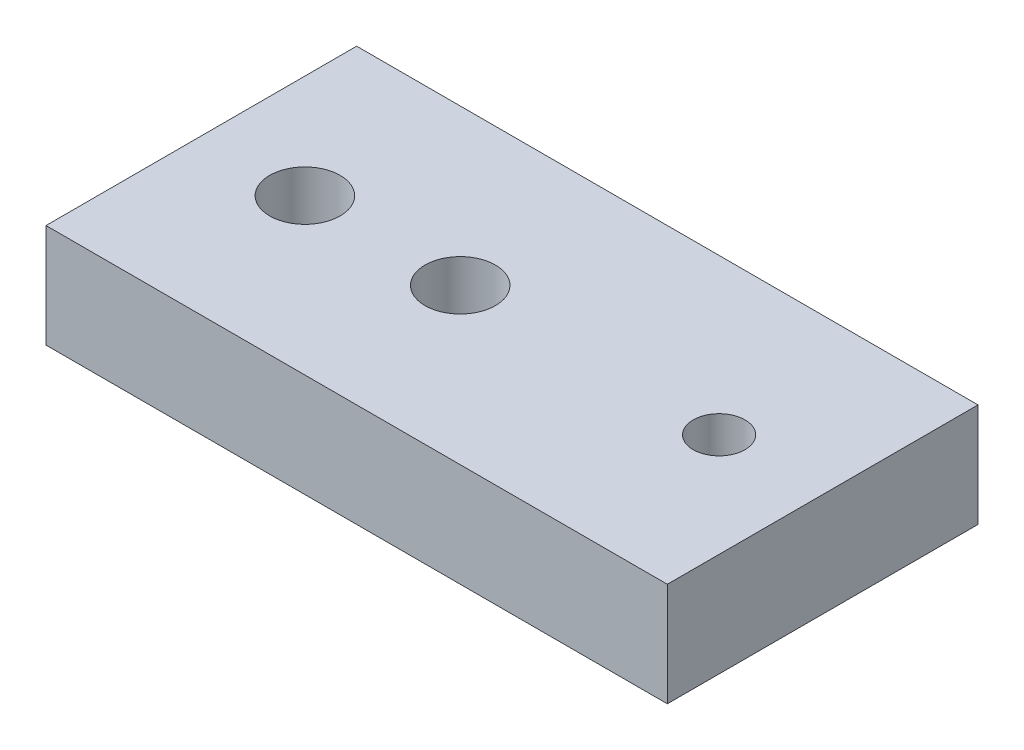
ISO-10303-21;
HEADER;
FILE_DESCRIPTION(('STEP AP214'),'2;1');
FILE_NAME('part.step','',(''),(''),'','','');
FILE_SCHEMA(('AUTOMOTIVE_DESIGN { 1 0 10303 214 1 1 1 1 }'));
ENDSEC;
DATA;
#1=APPLICATION_CONTEXT('core data for automotive mechanical design processes');
#2=APPLICATION_PROTOCOL_DEFINITION('international standard','automotive_design',2000,#1);
#3=PRODUCT_CONTEXT('',#1,'mechanical');
#4=PRODUCT('Part','Part','',(#3));
#5=PRODUCT_RELATED_PRODUCT_CATEGORY('part','',(#4));
#6=PRODUCT_DEFINITION_FORMATION('','',#4);
#7=PRODUCT_DEFINITION_CONTEXT('part definition',#1,'design');
#8=PRODUCT_DEFINITION('design','',#6,#7);
#9=PRODUCT_DEFINITION_SHAPE('','',#8);
#10=(LENGTH_UNIT() NAMED_UNIT(*) SI_UNIT(.MILLI.,.METRE.));
#11=(NAMED_UNIT(*) PLANE_ANGLE_UNIT() SI_UNIT($,.RADIAN.));
#12=(NAMED_UNIT(*) SI_UNIT($,.STERADIAN.) SOLID_ANGLE_UNIT());
#13=UNCERTAINTY_MEASURE_WITH_UNIT(LENGTH_MEASURE(1.E-05),#10,'distance_accuracy_value','');
#14=(GEOMETRIC_REPRESENTATION_CONTEXT(3) GLOBAL_UNCERTAINTY_ASSIGNED_CONTEXT((#13)) GLOBAL_UNIT_ASSIGNED_CONTEXT((#10,
#11,#12)) REPRESENTATION_CONTEXT('',''));
#15=CARTESIAN_POINT('',(0.,0.,0.));
#16=DIRECTION('',(0.,0.,1.));
#17=DIRECTION('',(1.,0.,0.));
#18=AXIS2_PLACEMENT_3D('',#15,#16,#17);
#19=CARTESIAN_POINT('',(30.,10.,-15.));
#20=DIRECTION('',(-1.,0.,0.));
#21=DIRECTION('',(0.,0.,1.));
#22=AXIS2_PLACEMENT_3D('',#19,#20,#21);
#23=PLANE('',#22);
#24=DIRECTION('',(0.,0.,-1.));
#25=VECTOR('',#24,1.);
#26=CARTESIAN_POINT('',(30.,0.,-15.));
#27=LINE('',#26,#25);
#28=CARTESIAN_POINT('',(30.,0.,15.));
#29=VERTEX_POINT('',#28);
#30=CARTESIAN_POINT('',(30.,0.,-15.));
#31=VERTEX_POINT('',#30);
#32=EDGE_CURVE('E101',#29,#31,#27,.T.);
#33=ORIENTED_EDGE('',*,*,#32,.T.);
#34=DIRECTION('',(0.,-1.,0.));
#35=VECTOR('',#34,1.);
#36=CARTESIAN_POINT('',(30.,10.,-15.));
#37=LINE('',#36,#35);
#38=CARTESIAN_POINT('',(30.,10.,-15.));
#39=VERTEX_POINT('',#38);
#40=EDGE_CURVE('E11',#39,#31,#37,.T.);
#41=ORIENTED_EDGE('',*,*,#40,.F.);
#42=DIRECTION('',(0.,0.,-1.));
#43=VECTOR('',#42,1.);
#44=CARTESIAN_POINT('',(30.,10.,-15.));
#45=LINE('',#44,#43);
#46=CARTESIAN_POINT('',(30.,10.,15.));
#47=VERTEX_POINT('',#46);
#48=EDGE_CURVE('E89',#47,#39,#45,.T.);
#49=ORIENTED_EDGE('',*,*,#48,.F.);
#50=DIRECTION('',(0.,-1.,0.));
#51=VECTOR('',#50,1.);
#52=CARTESIAN_POINT('',(30.,10.,15.));
#53=LINE('',#52,#51);
#54=EDGE_CURVE('E97',#47,#29,#53,.T.);
#55=ORIENTED_EDGE('',*,*,#54,.T.);
#56=EDGE_LOOP('',(#33,#41,#49,#55));
#57=FACE_BOUND('',#56,.T.);
#58=ADVANCED_FACE('F38',(#57),#23,.F.);
#59=CARTESIAN_POINT('',(-30.,10.,-15.));
#60=DIRECTION('',(0.,0.,1.));
#61=DIRECTION('',(1.,0.,0.));
#62=AXIS2_PLACEMENT_3D('',#59,#60,#61);
#63=PLANE('',#62);
#64=DIRECTION('',(-1.,0.,0.));
#65=VECTOR('',#64,1.);
#66=CARTESIAN_POINT('',(-30.,0.,-15.));
#67=LINE('',#66,#65);
#68=CARTESIAN_POINT('',(-30.,0.,-15.));
#69=VERTEX_POINT('',#68);
#70=EDGE_CURVE('E93',#31,#69,#67,.T.);
#71=ORIENTED_EDGE('',*,*,#70,.T.);
#72=DIRECTION('',(0.,-1.,0.));
#73=VECTOR('',#72,1.);
#74=CARTESIAN_POINT('',(-30.,10.,-15.));
#75=LINE('',#74,#73);
#76=CARTESIAN_POINT('',(-30.,10.,-15.));
#77=VERTEX_POINT('',#76);
#78=EDGE_CURVE('E46',#77,#69,#75,.T.);
#79=ORIENTED_EDGE('',*,*,#78,.F.);
#80=DIRECTION('',(-1.,0.,0.));
#81=VECTOR('',#80,1.);
#82=CARTESIAN_POINT('',(-30.,10.,-15.));
#83=LINE('',#82,#81);
#84=EDGE_CURVE('E84',#39,#77,#83,.T.);
#85=ORIENTED_EDGE('',*,*,#84,.F.);
#86=ORIENTED_EDGE('',*,*,#40,.T.);
#87=EDGE_LOOP('',(#71,#79,#85,#86));
#88=FACE_BOUND('',#87,.T.);
#89=ADVANCED_FACE('F92',(#88),#63,.F.);
#90=CARTESIAN_POINT('',(-30.,10.,-15.));
#91=DIRECTION('',(1.,0.,0.));
#92=DIRECTION('',(0.,0.,-1.));
#93=AXIS2_PLACEMENT_3D('',#90,#91,#92);
#94=PLANE('',#93);
#95=DIRECTION('',(0.,0.,1.));
#96=VECTOR('',#95,1.);
#97=CARTESIAN_POINT('',(-30.,0.,-15.));
#98=LINE('',#97,#96);
#99=CARTESIAN_POINT('',(-30.,0.,15.));
#100=VERTEX_POINT('',#99);
#101=EDGE_CURVE('E71',#69,#100,#98,.T.);
#102=ORIENTED_EDGE('',*,*,#101,.T.);
#103=DIRECTION('',(0.,-1.,0.));
#104=VECTOR('',#103,1.);
#105=CARTESIAN_POINT('',(-30.,10.,15.));
#106=LINE('',#105,#104);
#107=CARTESIAN_POINT('',(-30.,10.,15.));
#108=VERTEX_POINT('',#107);
#109=EDGE_CURVE('E94',#108,#100,#106,.T.);
#110=ORIENTED_EDGE('',*,*,#109,.F.);
#111=DIRECTION('',(0.,0.,1.));
#112=VECTOR('',#111,1.);
#113=CARTESIAN_POINT('',(-30.,10.,-15.));
#114=LINE('',#113,#112);
#115=EDGE_CURVE('E87',#77,#108,#114,.T.);
#116=ORIENTED_EDGE('',*,*,#115,.F.);
#117=ORIENTED_EDGE('',*,*,#78,.T.);
#118=EDGE_LOOP('',(#102,#110,#116,#117));
#119=FACE_BOUND('',#118,.T.);
#120=ADVANCED_FACE('F95',(#119),#94,.F.);
#121=CARTESIAN_POINT('',(-30.,10.,15.));
#122=DIRECTION('',(0.,0.,-1.));
#123=DIRECTION('',(-1.,0.,0.));
#124=AXIS2_PLACEMENT_3D('',#121,#122,#123);
#125=PLANE('',#124);
#126=DIRECTION('',(1.,0.,0.));
#127=VECTOR('',#126,1.);
#128=CARTESIAN_POINT('',(-30.,0.,15.));
#129=LINE('',#128,#127);
#130=EDGE_CURVE('E77',#100,#29,#129,.T.);
#131=ORIENTED_EDGE('',*,*,#130,.T.);
#132=ORIENTED_EDGE('',*,*,#54,.F.);
#133=DIRECTION('',(1.,0.,0.));
#134=VECTOR('',#133,1.);
#135=CARTESIAN_POINT('',(-30.,10.,15.));
#136=LINE('',#135,#134);
#137=EDGE_CURVE('E54',#108,#47,#136,.T.);
#138=ORIENTED_EDGE('',*,*,#137,.F.);
#139=ORIENTED_EDGE('',*,*,#109,.T.);
#140=EDGE_LOOP('',(#131,#132,#138,#139));
#141=FACE_BOUND('',#140,.T.);
#142=ADVANCED_FACE('F109',(#141),#125,.F.);
#143=CARTESIAN_POINT('',(0.,10.,0.));
#144=DIRECTION('',(0.,1.,0.));
#145=DIRECTION('',(0.,0.,1.));
#146=AXIS2_PLACEMENT_3D('',#143,#144,#145);
#147=PLANE('',#146);
#148=CARTESIAN_POINT('',(20.,10.,0.));
#149=DIRECTION('',(0.,1.,0.));
#150=DIRECTION('',(0.,0.,1.));
#151=AXIS2_PLACEMENT_3D('',#148,#149,#150);
#152=CIRCLE('',#151,2.5);
#153=CARTESIAN_POINT('',(20.,10.,2.5));
#154=VERTEX_POINT('',#153);
#155=EDGE_CURVE('E129',#154,#154,#152,.T.);
#156=ORIENTED_EDGE('',*,*,#155,.F.);
#157=EDGE_LOOP('',(#156));
#158=FACE_BOUND('',#157,.T.);
#159=CARTESIAN_POINT('',(-20.,10.,0.));
#160=DIRECTION('',(0.,1.,0.));
#161=DIRECTION('',(0.,0.,1.));
#162=AXIS2_PLACEMENT_3D('',#159,#160,#161);
#163=CIRCLE('',#162,3.39999999999999);
#164=CARTESIAN_POINT('',(-20.,10.,3.39999999999999));
#165=VERTEX_POINT('',#164);
#166=EDGE_CURVE('E123',#165,#165,#163,.T.);
#167=ORIENTED_EDGE('',*,*,#166,.F.);
#168=EDGE_LOOP('',(#167));
#169=FACE_BOUND('',#168,.T.);
#170=CARTESIAN_POINT('',(-5.,10.,0.));
#171=DIRECTION('',(0.,1.,0.));
#172=DIRECTION('',(0.,0.,1.));
#173=AXIS2_PLACEMENT_3D('',#170,#171,#172);
#174=CIRCLE('',#173,3.39999999999999);
#175=CARTESIAN_POINT('',(-5.,10.,3.39999999999999));
#176=VERTEX_POINT('',#175);
#177=EDGE_CURVE('E117',#176,#176,#174,.T.);
#178=ORIENTED_EDGE('',*,*,#177,.F.);
#179=EDGE_LOOP('',(#178));
#180=FACE_BOUND('',#179,.T.);
#181=ORIENTED_EDGE('',*,*,#48,.T.);
#182=ORIENTED_EDGE('',*,*,#84,.T.);
#183=ORIENTED_EDGE('',*,*,#115,.T.);
#184=ORIENTED_EDGE('',*,*,#137,.T.);
#185=EDGE_LOOP('',(#181,#182,#183,#184));
#186=FACE_BOUND('',#185,.T.);
#187=ADVANCED_FACE('F85',(#158,#169,#180,#186),#147,.T.);
#188=CARTESIAN_POINT('',(0.,0.,0.));
#189=DIRECTION('',(0.,1.,0.));
#190=DIRECTION('',(0.,0.,1.));
#191=AXIS2_PLACEMENT_3D('',#188,#189,#190);
#192=PLANE('',#191);
#193=CARTESIAN_POINT('',(20.,0.,0.));
#194=DIRECTION('',(0.,1.,0.));
#195=DIRECTION('',(0.,0.,1.));
#196=AXIS2_PLACEMENT_3D('',#193,#194,#195);
#197=CIRCLE('',#196,2.5);
#198=CARTESIAN_POINT('',(20.,0.,2.5));
#199=VERTEX_POINT('',#198);
#200=EDGE_CURVE('E126',#199,#199,#197,.T.);
#201=ORIENTED_EDGE('',*,*,#200,.T.);
#202=EDGE_LOOP('',(#201));
#203=FACE_BOUND('',#202,.T.);
#204=CARTESIAN_POINT('',(-20.,0.,0.));
#205=DIRECTION('',(0.,1.,0.));
#206=DIRECTION('',(0.,0.,1.));
#207=AXIS2_PLACEMENT_3D('',#204,#205,#206);
#208=CIRCLE('',#207,3.4);
#209=CARTESIAN_POINT('',(-20.,0.,3.4));
#210=VERTEX_POINT('',#209);
#211=EDGE_CURVE('E120',#210,#210,#208,.T.);
#212=ORIENTED_EDGE('',*,*,#211,.T.);
#213=EDGE_LOOP('',(#212));
#214=FACE_BOUND('',#213,.T.);
#215=CARTESIAN_POINT('',(-5.,0.,0.));
#216=DIRECTION('',(0.,1.,0.));
#217=DIRECTION('',(0.,0.,1.));
#218=AXIS2_PLACEMENT_3D('',#215,#216,#217);
#219=CIRCLE('',#218,3.4);
#220=CARTESIAN_POINT('',(-5.,0.,3.4));
#221=VERTEX_POINT('',#220);
#222=EDGE_CURVE('E104',#221,#221,#219,.T.);
#223=ORIENTED_EDGE('',*,*,#222,.T.);
#224=EDGE_LOOP('',(#223));
#225=FACE_BOUND('',#224,.T.);
#226=ORIENTED_EDGE('',*,*,#32,.F.);
#227=ORIENTED_EDGE('',*,*,#130,.F.);
#228=ORIENTED_EDGE('',*,*,#101,.F.);
#229=ORIENTED_EDGE('',*,*,#70,.F.);
#230=EDGE_LOOP('',(#226,#227,#228,#229));
#231=FACE_BOUND('',#230,.T.);
#232=ADVANCED_FACE('F112',(#203,#214,#225,#231),#192,.F.);
#233=CARTESIAN_POINT('',(-5.,10.,0.));
#234=DIRECTION('',(0.,1.,0.));
#235=DIRECTION('',(0.,0.,1.));
#236=AXIS2_PLACEMENT_3D('',#233,#234,#235);
#237=CYLINDRICAL_SURFACE('',#236,3.39999999999999);
#238=ORIENTED_EDGE('',*,*,#222,.F.);
#239=EDGE_LOOP('',(#238));
#240=FACE_BOUND('',#239,.T.);
#241=ORIENTED_EDGE('',*,*,#177,.T.);
#242=EDGE_LOOP('',(#241));
#243=FACE_BOUND('',#242,.T.);
#244=ADVANCED_FACE('F142',(#240,#243),#237,.F.);
#245=CARTESIAN_POINT('',(-20.,10.,0.));
#246=DIRECTION('',(0.,1.,0.));
#247=DIRECTION('',(0.,0.,1.));
#248=AXIS2_PLACEMENT_3D('',#245,#246,#247);
#249=CYLINDRICAL_SURFACE('',#248,3.39999999999999);
#250=ORIENTED_EDGE('',*,*,#211,.F.);
#251=EDGE_LOOP('',(#250));
#252=FACE_BOUND('',#251,.T.);
#253=ORIENTED_EDGE('',*,*,#166,.T.);
#254=EDGE_LOOP('',(#253));
#255=FACE_BOUND('',#254,.T.);
#256=ADVANCED_FACE('F144',(#252,#255),#249,.F.);
#257=CARTESIAN_POINT('',(20.,10.,0.));
#258=DIRECTION('',(0.,1.,0.));
#259=DIRECTION('',(0.,0.,1.));
#260=AXIS2_PLACEMENT_3D('',#257,#258,#259);
#261=CYLINDRICAL_SURFACE('',#260,2.5);
#262=ORIENTED_EDGE('',*,*,#200,.F.);
#263=EDGE_LOOP('',(#262));
#264=FACE_BOUND('',#263,.T.);
#265=ORIENTED_EDGE('',*,*,#155,.T.);
#266=EDGE_LOOP('',(#265));
#267=FACE_BOUND('',#266,.T.);
#268=ADVANCED_FACE('F133',(#264,#267),#261,.F.);
#269=CLOSED_SHELL('',(#58,#89,#120,#142,#187,#232,#244,#256,#268));
#270=MANIFOLD_SOLID_BREP('B2',#269);
#271=ADVANCED_BREP_SHAPE_REPRESENTATION('',(#18,#270),#14);
#272=SHAPE_DEFINITION_REPRESENTATION(#9,#271);
ENDSEC;
END-ISO-10303-21;
